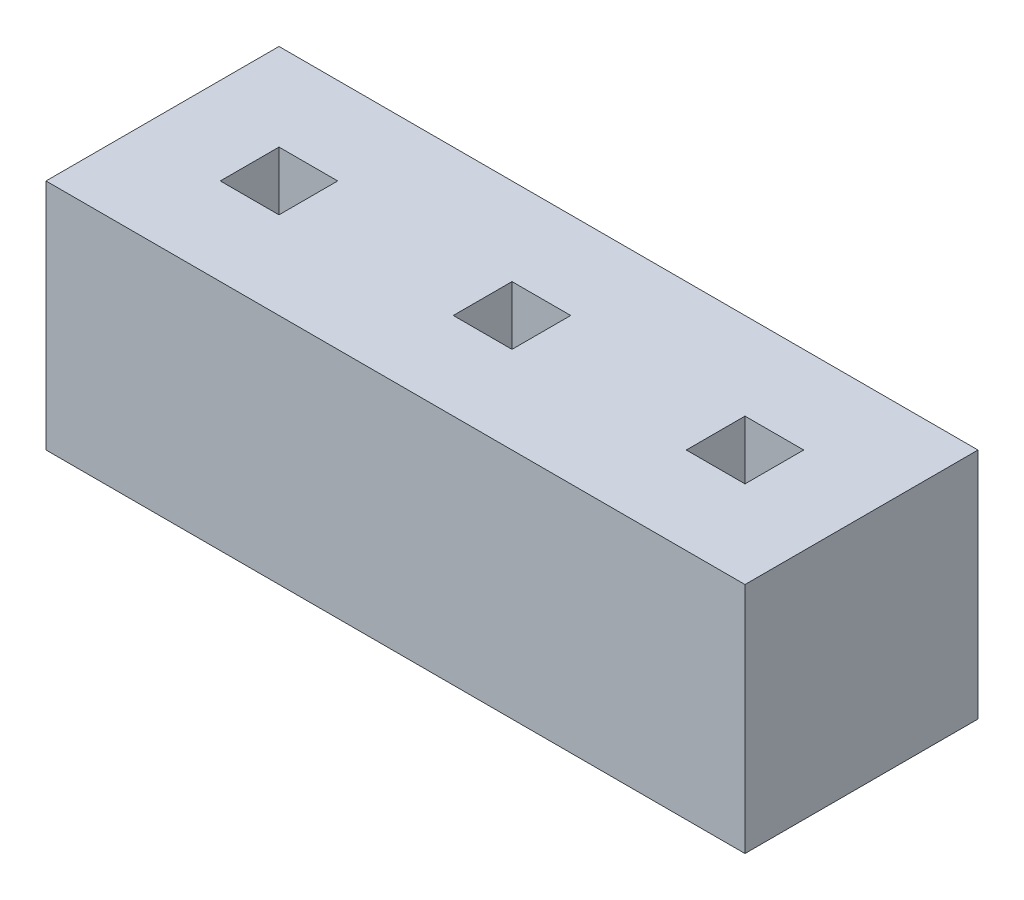
ISO-10303-21;
HEADER;
FILE_DESCRIPTION(('STEP AP214'),'2;1');
FILE_NAME('part.step','',(''),(''),'','','');
FILE_SCHEMA(('AUTOMOTIVE_DESIGN { 1 0 10303 214 1 1 1 1 }'));
ENDSEC;
DATA;
#1=APPLICATION_CONTEXT('core data for automotive mechanical design processes');
#2=APPLICATION_PROTOCOL_DEFINITION('international standard','automotive_design',2000,#1);
#3=PRODUCT_CONTEXT('',#1,'mechanical');
#4=PRODUCT('Part','Part','',(#3));
#5=PRODUCT_RELATED_PRODUCT_CATEGORY('part','',(#4));
#6=PRODUCT_DEFINITION_FORMATION('','',#4);
#7=PRODUCT_DEFINITION_CONTEXT('part definition',#1,'design');
#8=PRODUCT_DEFINITION('design','',#6,#7);
#9=PRODUCT_DEFINITION_SHAPE('','',#8);
#10=(LENGTH_UNIT() NAMED_UNIT(*) SI_UNIT(.MILLI.,.METRE.));
#11=(NAMED_UNIT(*) PLANE_ANGLE_UNIT() SI_UNIT($,.RADIAN.));
#12=(NAMED_UNIT(*) SI_UNIT($,.STERADIAN.) SOLID_ANGLE_UNIT());
#13=UNCERTAINTY_MEASURE_WITH_UNIT(LENGTH_MEASURE(1.E-05),#10,'distance_accuracy_value','');
#14=(GEOMETRIC_REPRESENTATION_CONTEXT(3) GLOBAL_UNCERTAINTY_ASSIGNED_CONTEXT((#13)) GLOBAL_UNIT_ASSIGNED_CONTEXT((#10,
#11,#12)) REPRESENTATION_CONTEXT('',''));
#15=CARTESIAN_POINT('',(0.,0.,0.));
#16=DIRECTION('',(0.,0.,1.));
#17=DIRECTION('',(1.,0.,0.));
#18=AXIS2_PLACEMENT_3D('',#15,#16,#17);
#19=CARTESIAN_POINT('',(3.81,2.54,1.27));
#20=DIRECTION('',(-1.,0.,0.));
#21=DIRECTION('',(0.,0.,1.));
#22=AXIS2_PLACEMENT_3D('',#19,#20,#21);
#23=PLANE('',#22);
#24=DIRECTION('',(0.,0.,-1.));
#25=VECTOR('',#24,1.);
#26=CARTESIAN_POINT('',(3.81,0.,1.27));
#27=LINE('',#26,#25);
#28=CARTESIAN_POINT('',(3.81,0.,1.27));
#29=VERTEX_POINT('',#28);
#30=CARTESIAN_POINT('',(3.81,0.,-1.27));
#31=VERTEX_POINT('',#30);
#32=EDGE_CURVE('E241',#29,#31,#27,.T.);
#33=ORIENTED_EDGE('',*,*,#32,.T.);
#34=DIRECTION('',(0.,-1.,0.));
#35=VECTOR('',#34,1.);
#36=CARTESIAN_POINT('',(3.81,2.54,-1.27));
#37=LINE('',#36,#35);
#38=CARTESIAN_POINT('',(3.81,2.54,-1.27));
#39=VERTEX_POINT('',#38);
#40=EDGE_CURVE('E11',#39,#31,#37,.T.);
#41=ORIENTED_EDGE('',*,*,#40,.F.);
#42=DIRECTION('',(0.,0.,-1.));
#43=VECTOR('',#42,1.);
#44=CARTESIAN_POINT('',(3.81,2.54,1.27));
#45=LINE('',#44,#43);
#46=CARTESIAN_POINT('',(3.81,2.54,1.27));
#47=VERTEX_POINT('',#46);
#48=EDGE_CURVE('E248',#47,#39,#45,.T.);
#49=ORIENTED_EDGE('',*,*,#48,.F.);
#50=DIRECTION('',(0.,-1.,0.));
#51=VECTOR('',#50,1.);
#52=CARTESIAN_POINT('',(3.81,2.54,1.27));
#53=LINE('',#52,#51);
#54=EDGE_CURVE('E258',#47,#29,#53,.T.);
#55=ORIENTED_EDGE('',*,*,#54,.T.);
#56=EDGE_LOOP('',(#33,#41,#49,#55));
#57=FACE_BOUND('',#56,.T.);
#58=ADVANCED_FACE('F35',(#57),#23,.F.);
#59=CARTESIAN_POINT('',(-3.81,2.54,-1.27));
#60=DIRECTION('',(0.,0.,1.));
#61=DIRECTION('',(1.,0.,0.));
#62=AXIS2_PLACEMENT_3D('',#59,#60,#61);
#63=PLANE('',#62);
#64=DIRECTION('',(-1.,0.,0.));
#65=VECTOR('',#64,1.);
#66=CARTESIAN_POINT('',(-3.81,0.,-1.27));
#67=LINE('',#66,#65);
#68=CARTESIAN_POINT('',(-3.81,0.,-1.27));
#69=VERTEX_POINT('',#68);
#70=EDGE_CURVE('E261',#31,#69,#67,.T.);
#71=ORIENTED_EDGE('',*,*,#70,.T.);
#72=DIRECTION('',(0.,-1.,0.));
#73=VECTOR('',#72,1.);
#74=CARTESIAN_POINT('',(-3.81,2.54,-1.27));
#75=LINE('',#74,#73);
#76=CARTESIAN_POINT('',(-3.81,2.54,-1.27));
#77=VERTEX_POINT('',#76);
#78=EDGE_CURVE('E42',#77,#69,#75,.T.);
#79=ORIENTED_EDGE('',*,*,#78,.F.);
#80=DIRECTION('',(-1.,0.,0.));
#81=VECTOR('',#80,1.);
#82=CARTESIAN_POINT('',(-3.81,2.54,-1.27));
#83=LINE('',#82,#81);
#84=EDGE_CURVE('E251',#39,#77,#83,.T.);
#85=ORIENTED_EDGE('',*,*,#84,.F.);
#86=ORIENTED_EDGE('',*,*,#40,.T.);
#87=EDGE_LOOP('',(#71,#79,#85,#86));
#88=FACE_BOUND('',#87,.T.);
#89=ADVANCED_FACE('F290',(#88),#63,.F.);
#90=CARTESIAN_POINT('',(-3.81,2.54,1.27));
#91=DIRECTION('',(1.,0.,0.));
#92=DIRECTION('',(0.,0.,-1.));
#93=AXIS2_PLACEMENT_3D('',#90,#91,#92);
#94=PLANE('',#93);
#95=DIRECTION('',(0.,0.,1.));
#96=VECTOR('',#95,1.);
#97=CARTESIAN_POINT('',(-3.81,0.,1.27));
#98=LINE('',#97,#96);
#99=CARTESIAN_POINT('',(-3.81,0.,1.27));
#100=VERTEX_POINT('',#99);
#101=EDGE_CURVE('E263',#69,#100,#98,.T.);
#102=ORIENTED_EDGE('',*,*,#101,.T.);
#103=DIRECTION('',(0.,-1.,0.));
#104=VECTOR('',#103,1.);
#105=CARTESIAN_POINT('',(-3.81,2.54,1.27));
#106=LINE('',#105,#104);
#107=CARTESIAN_POINT('',(-3.81,2.54,1.27));
#108=VERTEX_POINT('',#107);
#109=EDGE_CURVE('E268',#108,#100,#106,.T.);
#110=ORIENTED_EDGE('',*,*,#109,.F.);
#111=DIRECTION('',(0.,0.,1.));
#112=VECTOR('',#111,1.);
#113=CARTESIAN_POINT('',(-3.81,2.54,1.27));
#114=LINE('',#113,#112);
#115=EDGE_CURVE('E254',#77,#108,#114,.T.);
#116=ORIENTED_EDGE('',*,*,#115,.F.);
#117=ORIENTED_EDGE('',*,*,#78,.T.);
#118=EDGE_LOOP('',(#102,#110,#116,#117));
#119=FACE_BOUND('',#118,.T.);
#120=ADVANCED_FACE('F275',(#119),#94,.F.);
#121=CARTESIAN_POINT('',(-3.81,2.54,1.27));
#122=DIRECTION('',(0.,0.,-1.));
#123=DIRECTION('',(-1.,0.,0.));
#124=AXIS2_PLACEMENT_3D('',#121,#122,#123);
#125=PLANE('',#124);
#126=DIRECTION('',(1.,0.,0.));
#127=VECTOR('',#126,1.);
#128=CARTESIAN_POINT('',(-3.81,0.,1.27));
#129=LINE('',#128,#127);
#130=EDGE_CURVE('E252',#100,#29,#129,.T.);
#131=ORIENTED_EDGE('',*,*,#130,.T.);
#132=ORIENTED_EDGE('',*,*,#54,.F.);
#133=DIRECTION('',(1.,0.,0.));
#134=VECTOR('',#133,1.);
#135=CARTESIAN_POINT('',(-3.81,2.54,1.27));
#136=LINE('',#135,#134);
#137=EDGE_CURVE('E256',#108,#47,#136,.T.);
#138=ORIENTED_EDGE('',*,*,#137,.F.);
#139=ORIENTED_EDGE('',*,*,#109,.T.);
#140=EDGE_LOOP('',(#131,#132,#138,#139));
#141=FACE_BOUND('',#140,.T.);
#142=ADVANCED_FACE('F283',(#141),#125,.F.);
#143=CARTESIAN_POINT('',(0.,2.54,0.));
#144=DIRECTION('',(0.,-1.,0.));
#145=DIRECTION('',(0.,0.,-1.));
#146=AXIS2_PLACEMENT_3D('',#143,#144,#145);
#147=PLANE('',#146);
#148=DIRECTION('',(-1.,0.,0.));
#149=VECTOR('',#148,1.);
#150=CARTESIAN_POINT('',(2.22,2.54,-0.32));
#151=LINE('',#150,#149);
#152=CARTESIAN_POINT('',(2.86,2.54,-0.32));
#153=VERTEX_POINT('',#152);
#154=CARTESIAN_POINT('',(2.22,2.54,-0.32));
#155=VERTEX_POINT('',#154);
#156=EDGE_CURVE('E174',#153,#155,#151,.T.);
#157=ORIENTED_EDGE('',*,*,#156,.F.);
#158=DIRECTION('',(0.,0.,-1.));
#159=VECTOR('',#158,1.);
#160=CARTESIAN_POINT('',(2.86,2.54,0.32));
#161=LINE('',#160,#159);
#162=CARTESIAN_POINT('',(2.86,2.54,0.32));
#163=VERTEX_POINT('',#162);
#164=EDGE_CURVE('E49',#163,#153,#161,.T.);
#165=ORIENTED_EDGE('',*,*,#164,.F.);
#166=DIRECTION('',(1.,0.,0.));
#167=VECTOR('',#166,1.);
#168=CARTESIAN_POINT('',(2.22,2.54,0.32));
#169=LINE('',#168,#167);
#170=CARTESIAN_POINT('',(2.22,2.54,0.32));
#171=VERTEX_POINT('',#170);
#172=EDGE_CURVE('E165',#171,#163,#169,.T.);
#173=ORIENTED_EDGE('',*,*,#172,.F.);
#174=DIRECTION('',(0.,0.,1.));
#175=VECTOR('',#174,1.);
#176=CARTESIAN_POINT('',(2.22,2.54,0.32));
#177=LINE('',#176,#175);
#178=EDGE_CURVE('E168',#155,#171,#177,.T.);
#179=ORIENTED_EDGE('',*,*,#178,.F.);
#180=EDGE_LOOP('',(#157,#165,#173,#179));
#181=FACE_BOUND('',#180,.T.);
#182=DIRECTION('',(-1.,0.,0.));
#183=VECTOR('',#182,1.);
#184=CARTESIAN_POINT('',(-2.86,2.54,-0.32));
#185=LINE('',#184,#183);
#186=CARTESIAN_POINT('',(-2.22,2.54,-0.32));
#187=VERTEX_POINT('',#186);
#188=CARTESIAN_POINT('',(-2.86,2.54,-0.32));
#189=VERTEX_POINT('',#188);
#190=EDGE_CURVE('E199',#187,#189,#185,.T.);
#191=ORIENTED_EDGE('',*,*,#190,.F.);
#192=DIRECTION('',(0.,0.,-1.));
#193=VECTOR('',#192,1.);
#194=CARTESIAN_POINT('',(-2.22,2.54,0.32));
#195=LINE('',#194,#193);
#196=CARTESIAN_POINT('',(-2.22,2.54,0.32));
#197=VERTEX_POINT('',#196);
#198=EDGE_CURVE('E180',#197,#187,#195,.T.);
#199=ORIENTED_EDGE('',*,*,#198,.F.);
#200=DIRECTION('',(1.,0.,0.));
#201=VECTOR('',#200,1.);
#202=CARTESIAN_POINT('',(-2.86,2.54,0.32));
#203=LINE('',#202,#201);
#204=CARTESIAN_POINT('',(-2.86,2.54,0.32));
#205=VERTEX_POINT('',#204);
#206=EDGE_CURVE('E188',#205,#197,#203,.T.);
#207=ORIENTED_EDGE('',*,*,#206,.F.);
#208=DIRECTION('',(0.,0.,1.));
#209=VECTOR('',#208,1.);
#210=CARTESIAN_POINT('',(-2.86,2.54,0.32));
#211=LINE('',#210,#209);
#212=EDGE_CURVE('E202',#189,#205,#211,.T.);
#213=ORIENTED_EDGE('',*,*,#212,.F.);
#214=EDGE_LOOP('',(#191,#199,#207,#213));
#215=FACE_BOUND('',#214,.T.);
#216=DIRECTION('',(-1.,0.,0.));
#217=VECTOR('',#216,1.);
#218=CARTESIAN_POINT('',(-0.32,2.54,-0.32));
#219=LINE('',#218,#217);
#220=CARTESIAN_POINT('',(0.32,2.54,-0.32));
#221=VERTEX_POINT('',#220);
#222=CARTESIAN_POINT('',(-0.32,2.54,-0.32));
#223=VERTEX_POINT('',#222);
#224=EDGE_CURVE('E231',#221,#223,#219,.T.);
#225=ORIENTED_EDGE('',*,*,#224,.F.);
#226=DIRECTION('',(0.,0.,-1.));
#227=VECTOR('',#226,1.);
#228=CARTESIAN_POINT('',(0.32,2.54,0.32));
#229=LINE('',#228,#227);
#230=CARTESIAN_POINT('',(0.32,2.54,0.32));
#231=VERTEX_POINT('',#230);
#232=EDGE_CURVE('E209',#231,#221,#229,.T.);
#233=ORIENTED_EDGE('',*,*,#232,.F.);
#234=DIRECTION('',(1.,0.,0.));
#235=VECTOR('',#234,1.);
#236=CARTESIAN_POINT('',(-0.32,2.54,0.32));
#237=LINE('',#236,#235);
#238=CARTESIAN_POINT('',(-0.32,2.54,0.32));
#239=VERTEX_POINT('',#238);
#240=EDGE_CURVE('E220',#239,#231,#237,.T.);
#241=ORIENTED_EDGE('',*,*,#240,.F.);
#242=DIRECTION('',(0.,0.,1.));
#243=VECTOR('',#242,1.);
#244=CARTESIAN_POINT('',(-0.32,2.54,0.32));
#245=LINE('',#244,#243);
#246=EDGE_CURVE('E234',#223,#239,#245,.T.);
#247=ORIENTED_EDGE('',*,*,#246,.F.);
#248=EDGE_LOOP('',(#225,#233,#241,#247));
#249=FACE_BOUND('',#248,.T.);
#250=ORIENTED_EDGE('',*,*,#48,.T.);
#251=ORIENTED_EDGE('',*,*,#84,.T.);
#252=ORIENTED_EDGE('',*,*,#115,.T.);
#253=ORIENTED_EDGE('',*,*,#137,.T.);
#254=EDGE_LOOP('',(#250,#251,#252,#253));
#255=FACE_BOUND('',#254,.T.);
#256=ADVANCED_FACE('F289',(#181,#215,#249,#255),#147,.F.);
#257=CARTESIAN_POINT('',(0.,0.,0.));
#258=DIRECTION('',(0.,-1.,0.));
#259=DIRECTION('',(0.,0.,-1.));
#260=AXIS2_PLACEMENT_3D('',#257,#258,#259);
#261=PLANE('',#260);
#262=DIRECTION('',(0.,0.,-1.));
#263=VECTOR('',#262,1.);
#264=CARTESIAN_POINT('',(2.86,0.,0.32));
#265=LINE('',#264,#263);
#266=CARTESIAN_POINT('',(2.86,0.,0.32));
#267=VERTEX_POINT('',#266);
#268=CARTESIAN_POINT('',(2.86,0.,-0.32));
#269=VERTEX_POINT('',#268);
#270=EDGE_CURVE('E149',#267,#269,#265,.T.);
#271=ORIENTED_EDGE('',*,*,#270,.T.);
#272=DIRECTION('',(-1.,0.,0.));
#273=VECTOR('',#272,1.);
#274=CARTESIAN_POINT('',(2.22,0.,-0.32));
#275=LINE('',#274,#273);
#276=CARTESIAN_POINT('',(2.22,0.,-0.32));
#277=VERTEX_POINT('',#276);
#278=EDGE_CURVE('E158',#269,#277,#275,.T.);
#279=ORIENTED_EDGE('',*,*,#278,.T.);
#280=DIRECTION('',(0.,0.,1.));
#281=VECTOR('',#280,1.);
#282=CARTESIAN_POINT('',(2.22,0.,0.32));
#283=LINE('',#282,#281);
#284=CARTESIAN_POINT('',(2.22,0.,0.32));
#285=VERTEX_POINT('',#284);
#286=EDGE_CURVE('E57',#277,#285,#283,.T.);
#287=ORIENTED_EDGE('',*,*,#286,.T.);
#288=DIRECTION('',(1.,0.,0.));
#289=VECTOR('',#288,1.);
#290=CARTESIAN_POINT('',(2.22,0.,0.32));
#291=LINE('',#290,#289);
#292=EDGE_CURVE('E155',#285,#267,#291,.T.);
#293=ORIENTED_EDGE('',*,*,#292,.T.);
#294=EDGE_LOOP('',(#271,#279,#287,#293));
#295=FACE_BOUND('',#294,.T.);
#296=DIRECTION('',(0.,0.,-1.));
#297=VECTOR('',#296,1.);
#298=CARTESIAN_POINT('',(-2.22,0.,0.32));
#299=LINE('',#298,#297);
#300=CARTESIAN_POINT('',(-2.22,0.,0.32));
#301=VERTEX_POINT('',#300);
#302=CARTESIAN_POINT('',(-2.22,0.,-0.32));
#303=VERTEX_POINT('',#302);
#304=EDGE_CURVE('E184',#301,#303,#299,.T.);
#305=ORIENTED_EDGE('',*,*,#304,.T.);
#306=DIRECTION('',(-1.,0.,0.));
#307=VECTOR('',#306,1.);
#308=CARTESIAN_POINT('',(-2.86,0.,-0.32));
#309=LINE('',#308,#307);
#310=CARTESIAN_POINT('',(-2.86,0.,-0.32));
#311=VERTEX_POINT('',#310);
#312=EDGE_CURVE('E187',#303,#311,#309,.T.);
#313=ORIENTED_EDGE('',*,*,#312,.T.);
#314=DIRECTION('',(0.,0.,1.));
#315=VECTOR('',#314,1.);
#316=CARTESIAN_POINT('',(-2.86,0.,0.32));
#317=LINE('',#316,#315);
#318=CARTESIAN_POINT('',(-2.86,0.,0.32));
#319=VERTEX_POINT('',#318);
#320=EDGE_CURVE('E191',#311,#319,#317,.T.);
#321=ORIENTED_EDGE('',*,*,#320,.T.);
#322=DIRECTION('',(1.,0.,0.));
#323=VECTOR('',#322,1.);
#324=CARTESIAN_POINT('',(-2.86,0.,0.32));
#325=LINE('',#324,#323);
#326=EDGE_CURVE('E194',#319,#301,#325,.T.);
#327=ORIENTED_EDGE('',*,*,#326,.T.);
#328=EDGE_LOOP('',(#305,#313,#321,#327));
#329=FACE_BOUND('',#328,.T.);
#330=DIRECTION('',(0.,0.,-1.));
#331=VECTOR('',#330,1.);
#332=CARTESIAN_POINT('',(0.32,0.,0.32));
#333=LINE('',#332,#331);
#334=CARTESIAN_POINT('',(0.32,0.,0.32));
#335=VERTEX_POINT('',#334);
#336=CARTESIAN_POINT('',(0.32,0.,-0.32));
#337=VERTEX_POINT('',#336);
#338=EDGE_CURVE('E216',#335,#337,#333,.T.);
#339=ORIENTED_EDGE('',*,*,#338,.T.);
#340=DIRECTION('',(-1.,0.,0.));
#341=VECTOR('',#340,1.);
#342=CARTESIAN_POINT('',(-0.32,0.,-0.32));
#343=LINE('',#342,#341);
#344=CARTESIAN_POINT('',(-0.32,0.,-0.32));
#345=VERTEX_POINT('',#344);
#346=EDGE_CURVE('E219',#337,#345,#343,.T.);
#347=ORIENTED_EDGE('',*,*,#346,.T.);
#348=DIRECTION('',(0.,0.,1.));
#349=VECTOR('',#348,1.);
#350=CARTESIAN_POINT('',(-0.32,0.,0.32));
#351=LINE('',#350,#349);
#352=CARTESIAN_POINT('',(-0.32,0.,0.32));
#353=VERTEX_POINT('',#352);
#354=EDGE_CURVE('E223',#345,#353,#351,.T.);
#355=ORIENTED_EDGE('',*,*,#354,.T.);
#356=DIRECTION('',(1.,0.,0.));
#357=VECTOR('',#356,1.);
#358=CARTESIAN_POINT('',(-0.32,0.,0.32));
#359=LINE('',#358,#357);
#360=EDGE_CURVE('E226',#353,#335,#359,.T.);
#361=ORIENTED_EDGE('',*,*,#360,.T.);
#362=EDGE_LOOP('',(#339,#347,#355,#361));
#363=FACE_BOUND('',#362,.T.);
#364=ORIENTED_EDGE('',*,*,#32,.F.);
#365=ORIENTED_EDGE('',*,*,#130,.F.);
#366=ORIENTED_EDGE('',*,*,#101,.F.);
#367=ORIENTED_EDGE('',*,*,#70,.F.);
#368=EDGE_LOOP('',(#364,#365,#366,#367));
#369=FACE_BOUND('',#368,.T.);
#370=ADVANCED_FACE('F162',(#295,#329,#363,#369),#261,.T.);
#371=CARTESIAN_POINT('',(0.32,0.,0.32));
#372=DIRECTION('',(1.,0.,0.));
#373=DIRECTION('',(0.,0.,-1.));
#374=AXIS2_PLACEMENT_3D('',#371,#372,#373);
#375=PLANE('',#374);
#376=ORIENTED_EDGE('',*,*,#232,.T.);
#377=DIRECTION('',(0.,1.,0.));
#378=VECTOR('',#377,1.);
#379=CARTESIAN_POINT('',(0.32,0.,-0.32));
#380=LINE('',#379,#378);
#381=EDGE_CURVE('E229',#337,#221,#380,.T.);
#382=ORIENTED_EDGE('',*,*,#381,.F.);
#383=ORIENTED_EDGE('',*,*,#338,.F.);
#384=DIRECTION('',(0.,1.,0.));
#385=VECTOR('',#384,1.);
#386=CARTESIAN_POINT('',(0.32,0.,0.32));
#387=LINE('',#386,#385);
#388=EDGE_CURVE('E239',#335,#231,#387,.T.);
#389=ORIENTED_EDGE('',*,*,#388,.T.);
#390=EDGE_LOOP('',(#376,#382,#383,#389));
#391=FACE_BOUND('',#390,.T.);
#392=ADVANCED_FACE('F302',(#391),#375,.F.);
#393=CARTESIAN_POINT('',(-0.32,0.,0.32));
#394=DIRECTION('',(0.,0.,1.));
#395=DIRECTION('',(1.,0.,0.));
#396=AXIS2_PLACEMENT_3D('',#393,#394,#395);
#397=PLANE('',#396);
#398=ORIENTED_EDGE('',*,*,#240,.T.);
#399=ORIENTED_EDGE('',*,*,#388,.F.);
#400=ORIENTED_EDGE('',*,*,#360,.F.);
#401=DIRECTION('',(0.,1.,0.));
#402=VECTOR('',#401,1.);
#403=CARTESIAN_POINT('',(-0.32,0.,0.32));
#404=LINE('',#403,#402);
#405=EDGE_CURVE('E242',#353,#239,#404,.T.);
#406=ORIENTED_EDGE('',*,*,#405,.T.);
#407=EDGE_LOOP('',(#398,#399,#400,#406));
#408=FACE_BOUND('',#407,.T.);
#409=ADVANCED_FACE('F308',(#408),#397,.F.);
#410=CARTESIAN_POINT('',(-0.32,0.,0.32));
#411=DIRECTION('',(-1.,0.,0.));
#412=DIRECTION('',(0.,0.,1.));
#413=AXIS2_PLACEMENT_3D('',#410,#411,#412);
#414=PLANE('',#413);
#415=ORIENTED_EDGE('',*,*,#246,.T.);
#416=ORIENTED_EDGE('',*,*,#405,.F.);
#417=ORIENTED_EDGE('',*,*,#354,.F.);
#418=DIRECTION('',(0.,1.,0.));
#419=VECTOR('',#418,1.);
#420=CARTESIAN_POINT('',(-0.32,0.,-0.32));
#421=LINE('',#420,#419);
#422=EDGE_CURVE('E244',#345,#223,#421,.T.);
#423=ORIENTED_EDGE('',*,*,#422,.T.);
#424=EDGE_LOOP('',(#415,#416,#417,#423));
#425=FACE_BOUND('',#424,.T.);
#426=ADVANCED_FACE('F314',(#425),#414,.F.);
#427=CARTESIAN_POINT('',(-0.32,0.,-0.32));
#428=DIRECTION('',(0.,0.,-1.));
#429=DIRECTION('',(-1.,0.,0.));
#430=AXIS2_PLACEMENT_3D('',#427,#428,#429);
#431=PLANE('',#430);
#432=ORIENTED_EDGE('',*,*,#224,.T.);
#433=ORIENTED_EDGE('',*,*,#422,.F.);
#434=ORIENTED_EDGE('',*,*,#346,.F.);
#435=ORIENTED_EDGE('',*,*,#381,.T.);
#436=EDGE_LOOP('',(#432,#433,#434,#435));
#437=FACE_BOUND('',#436,.T.);
#438=ADVANCED_FACE('F310',(#437),#431,.F.);
#439=CARTESIAN_POINT('',(-2.22,0.,0.32));
#440=DIRECTION('',(1.,0.,0.));
#441=DIRECTION('',(0.,0.,-1.));
#442=AXIS2_PLACEMENT_3D('',#439,#440,#441);
#443=PLANE('',#442);
#444=ORIENTED_EDGE('',*,*,#198,.T.);
#445=DIRECTION('',(0.,1.,0.));
#446=VECTOR('',#445,1.);
#447=CARTESIAN_POINT('',(-2.22,0.,-0.32));
#448=LINE('',#447,#446);
#449=EDGE_CURVE('E197',#303,#187,#448,.T.);
#450=ORIENTED_EDGE('',*,*,#449,.F.);
#451=ORIENTED_EDGE('',*,*,#304,.F.);
#452=DIRECTION('',(0.,1.,0.));
#453=VECTOR('',#452,1.);
#454=CARTESIAN_POINT('',(-2.22,0.,0.32));
#455=LINE('',#454,#453);
#456=EDGE_CURVE('E207',#301,#197,#455,.T.);
#457=ORIENTED_EDGE('',*,*,#456,.T.);
#458=EDGE_LOOP('',(#444,#450,#451,#457));
#459=FACE_BOUND('',#458,.T.);
#460=ADVANCED_FACE('F313',(#459),#443,.F.);
#461=CARTESIAN_POINT('',(-2.86,0.,0.32));
#462=DIRECTION('',(0.,0.,1.));
#463=DIRECTION('',(1.,0.,0.));
#464=AXIS2_PLACEMENT_3D('',#461,#462,#463);
#465=PLANE('',#464);
#466=ORIENTED_EDGE('',*,*,#206,.T.);
#467=ORIENTED_EDGE('',*,*,#456,.F.);
#468=ORIENTED_EDGE('',*,*,#326,.F.);
#469=DIRECTION('',(0.,1.,0.));
#470=VECTOR('',#469,1.);
#471=CARTESIAN_POINT('',(-2.86,0.,0.32));
#472=LINE('',#471,#470);
#473=EDGE_CURVE('E210',#319,#205,#472,.T.);
#474=ORIENTED_EDGE('',*,*,#473,.T.);
#475=EDGE_LOOP('',(#466,#467,#468,#474));
#476=FACE_BOUND('',#475,.T.);
#477=ADVANCED_FACE('F324',(#476),#465,.F.);
#478=CARTESIAN_POINT('',(-2.86,0.,0.32));
#479=DIRECTION('',(-1.,0.,0.));
#480=DIRECTION('',(0.,0.,1.));
#481=AXIS2_PLACEMENT_3D('',#478,#479,#480);
#482=PLANE('',#481);
#483=ORIENTED_EDGE('',*,*,#212,.T.);
#484=ORIENTED_EDGE('',*,*,#473,.F.);
#485=ORIENTED_EDGE('',*,*,#320,.F.);
#486=DIRECTION('',(0.,1.,0.));
#487=VECTOR('',#486,1.);
#488=CARTESIAN_POINT('',(-2.86,0.,-0.32));
#489=LINE('',#488,#487);
#490=EDGE_CURVE('E212',#311,#189,#489,.T.);
#491=ORIENTED_EDGE('',*,*,#490,.T.);
#492=EDGE_LOOP('',(#483,#484,#485,#491));
#493=FACE_BOUND('',#492,.T.);
#494=ADVANCED_FACE('F329',(#493),#482,.F.);
#495=CARTESIAN_POINT('',(-2.86,0.,-0.32));
#496=DIRECTION('',(0.,0.,-1.));
#497=DIRECTION('',(-1.,0.,0.));
#498=AXIS2_PLACEMENT_3D('',#495,#496,#497);
#499=PLANE('',#498);
#500=ORIENTED_EDGE('',*,*,#190,.T.);
#501=ORIENTED_EDGE('',*,*,#490,.F.);
#502=ORIENTED_EDGE('',*,*,#312,.F.);
#503=ORIENTED_EDGE('',*,*,#449,.T.);
#504=EDGE_LOOP('',(#500,#501,#502,#503));
#505=FACE_BOUND('',#504,.T.);
#506=ADVANCED_FACE('F326',(#505),#499,.F.);
#507=CARTESIAN_POINT('',(2.86,0.,0.32));
#508=DIRECTION('',(1.,0.,0.));
#509=DIRECTION('',(0.,0.,-1.));
#510=AXIS2_PLACEMENT_3D('',#507,#508,#509);
#511=PLANE('',#510);
#512=ORIENTED_EDGE('',*,*,#164,.T.);
#513=DIRECTION('',(0.,1.,0.));
#514=VECTOR('',#513,1.);
#515=CARTESIAN_POINT('',(2.86,0.,-0.32));
#516=LINE('',#515,#514);
#517=EDGE_CURVE('E145',#269,#153,#516,.T.);
#518=ORIENTED_EDGE('',*,*,#517,.F.);
#519=ORIENTED_EDGE('',*,*,#270,.F.);
#520=DIRECTION('',(0.,1.,0.));
#521=VECTOR('',#520,1.);
#522=CARTESIAN_POINT('',(2.86,0.,0.32));
#523=LINE('',#522,#521);
#524=EDGE_CURVE('E178',#267,#163,#523,.T.);
#525=ORIENTED_EDGE('',*,*,#524,.T.);
#526=EDGE_LOOP('',(#512,#518,#519,#525));
#527=FACE_BOUND('',#526,.T.);
#528=ADVANCED_FACE('F147',(#527),#511,.F.);
#529=CARTESIAN_POINT('',(2.22,0.,0.32));
#530=DIRECTION('',(0.,0.,1.));
#531=DIRECTION('',(1.,0.,0.));
#532=AXIS2_PLACEMENT_3D('',#529,#530,#531);
#533=PLANE('',#532);
#534=ORIENTED_EDGE('',*,*,#172,.T.);
#535=ORIENTED_EDGE('',*,*,#524,.F.);
#536=ORIENTED_EDGE('',*,*,#292,.F.);
#537=DIRECTION('',(0.,1.,0.));
#538=VECTOR('',#537,1.);
#539=CARTESIAN_POINT('',(2.22,0.,0.32));
#540=LINE('',#539,#538);
#541=EDGE_CURVE('E181',#285,#171,#540,.T.);
#542=ORIENTED_EDGE('',*,*,#541,.T.);
#543=EDGE_LOOP('',(#534,#535,#536,#542));
#544=FACE_BOUND('',#543,.T.);
#545=ADVANCED_FACE('F339',(#544),#533,.F.);
#546=CARTESIAN_POINT('',(2.22,0.,0.32));
#547=DIRECTION('',(-1.,0.,0.));
#548=DIRECTION('',(0.,0.,1.));
#549=AXIS2_PLACEMENT_3D('',#546,#547,#548);
#550=PLANE('',#549);
#551=ORIENTED_EDGE('',*,*,#178,.T.);
#552=ORIENTED_EDGE('',*,*,#541,.F.);
#553=ORIENTED_EDGE('',*,*,#286,.F.);
#554=DIRECTION('',(0.,1.,0.));
#555=VECTOR('',#554,1.);
#556=CARTESIAN_POINT('',(2.22,0.,-0.32));
#557=LINE('',#556,#555);
#558=EDGE_CURVE('E154',#277,#155,#557,.T.);
#559=ORIENTED_EDGE('',*,*,#558,.T.);
#560=EDGE_LOOP('',(#551,#552,#553,#559));
#561=FACE_BOUND('',#560,.T.);
#562=ADVANCED_FACE('F342',(#561),#550,.F.);
#563=CARTESIAN_POINT('',(2.22,0.,-0.32));
#564=DIRECTION('',(0.,0.,-1.));
#565=DIRECTION('',(-1.,0.,0.));
#566=AXIS2_PLACEMENT_3D('',#563,#564,#565);
#567=PLANE('',#566);
#568=ORIENTED_EDGE('',*,*,#156,.T.);
#569=ORIENTED_EDGE('',*,*,#558,.F.);
#570=ORIENTED_EDGE('',*,*,#278,.F.);
#571=ORIENTED_EDGE('',*,*,#517,.T.);
#572=EDGE_LOOP('',(#568,#569,#570,#571));
#573=FACE_BOUND('',#572,.T.);
#574=ADVANCED_FACE('F159',(#573),#567,.F.);
#575=CLOSED_SHELL('',(#58,#89,#120,#142,#256,#370,#392,#409,#426,#438,#460,#477,#494,#506,#528,
#545,#562,#574));
#576=MANIFOLD_SOLID_BREP('B2',#575);
#577=ADVANCED_BREP_SHAPE_REPRESENTATION('',(#18,#576),#14);
#578=SHAPE_DEFINITION_REPRESENTATION(#9,#577);
ENDSEC;
END-ISO-10303-21;
